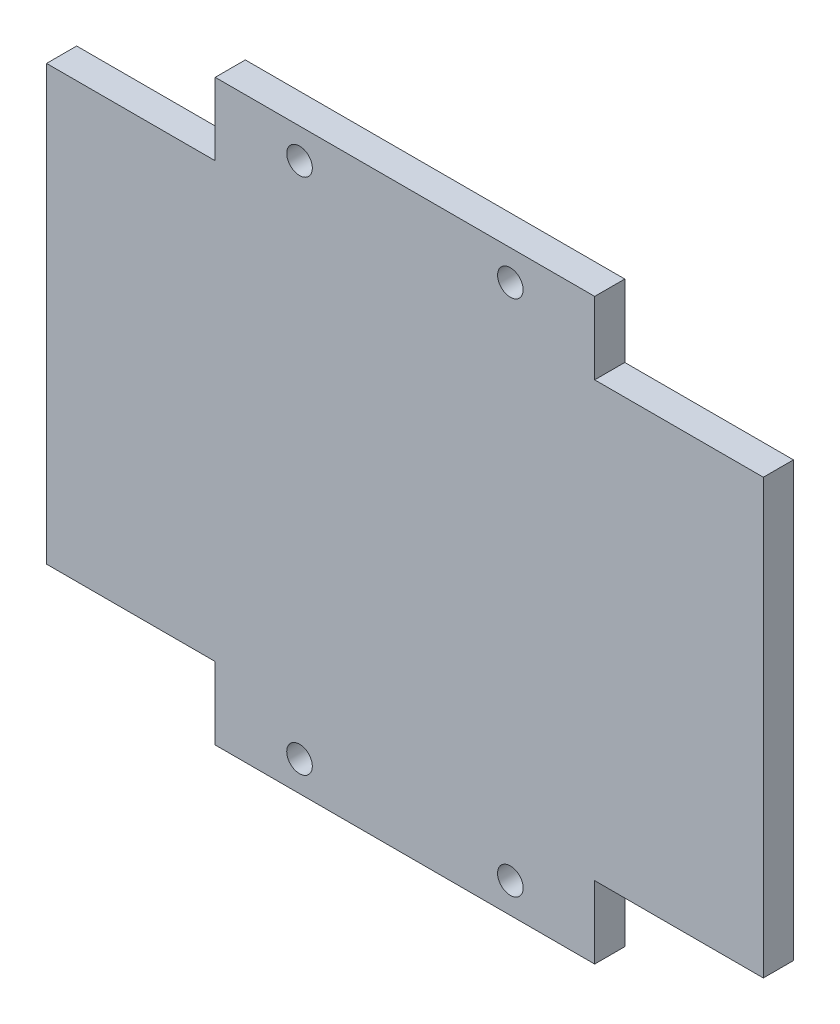
ISO-10303-21;
HEADER;
FILE_DESCRIPTION(('STEP AP214'),'2;1');
FILE_NAME('part.step','',(''),(''),'','','');
FILE_SCHEMA(('AUTOMOTIVE_DESIGN { 1 0 10303 214 1 1 1 1 }'));
ENDSEC;
DATA;
#1=APPLICATION_CONTEXT('core data for automotive mechanical design processes');
#2=APPLICATION_PROTOCOL_DEFINITION('international standard','automotive_design',2000,#1);
#3=PRODUCT_CONTEXT('',#1,'mechanical');
#4=PRODUCT('Part','Part','',(#3));
#5=PRODUCT_RELATED_PRODUCT_CATEGORY('part','',(#4));
#6=PRODUCT_DEFINITION_FORMATION('','',#4);
#7=PRODUCT_DEFINITION_CONTEXT('part definition',#1,'design');
#8=PRODUCT_DEFINITION('design','',#6,#7);
#9=PRODUCT_DEFINITION_SHAPE('','',#8);
#10=(LENGTH_UNIT() NAMED_UNIT(*) SI_UNIT(.MILLI.,.METRE.));
#11=(NAMED_UNIT(*) PLANE_ANGLE_UNIT() SI_UNIT($,.RADIAN.));
#12=(NAMED_UNIT(*) SI_UNIT($,.STERADIAN.) SOLID_ANGLE_UNIT());
#13=UNCERTAINTY_MEASURE_WITH_UNIT(LENGTH_MEASURE(1.E-05),#10,'distance_accuracy_value','');
#14=(GEOMETRIC_REPRESENTATION_CONTEXT(3) GLOBAL_UNCERTAINTY_ASSIGNED_CONTEXT((#13)) GLOBAL_UNIT_ASSIGNED_CONTEXT((#10,
#11,#12)) REPRESENTATION_CONTEXT('',''));
#15=CARTESIAN_POINT('',(0.,0.,0.));
#16=DIRECTION('',(0.,0.,1.));
#17=DIRECTION('',(1.,0.,0.));
#18=AXIS2_PLACEMENT_3D('',#15,#16,#17);
#19=CARTESIAN_POINT('',(0.,0.,5.));
#20=DIRECTION('',(1.,0.,0.));
#21=DIRECTION('',(0.,0.,-1.));
#22=AXIS2_PLACEMENT_3D('',#19,#20,#21);
#23=PLANE('',#22);
#24=DIRECTION('',(0.,0.,1.));
#25=VECTOR('',#24,1.);
#26=CARTESIAN_POINT('',(0.,12.,0.));
#27=LINE('',#26,#25);
#28=CARTESIAN_POINT('',(0.,12.,0.));
#29=VERTEX_POINT('',#28);
#30=CARTESIAN_POINT('',(0.,12.,5.));
#31=VERTEX_POINT('',#30);
#32=EDGE_CURVE('E135',#29,#31,#27,.T.);
#33=ORIENTED_EDGE('',*,*,#32,.F.);
#34=DIRECTION('',(0.,-1.,0.));
#35=VECTOR('',#34,1.);
#36=CARTESIAN_POINT('',(0.,0.,0.));
#37=LINE('',#36,#35);
#38=CARTESIAN_POINT('',(0.,0.,0.));
#39=VERTEX_POINT('',#38);
#40=EDGE_CURVE('E188',#29,#39,#37,.T.);
#41=ORIENTED_EDGE('',*,*,#40,.T.);
#42=DIRECTION('',(0.,0.,-1.));
#43=VECTOR('',#42,1.);
#44=CARTESIAN_POINT('',(0.,0.,5.));
#45=LINE('',#44,#43);
#46=CARTESIAN_POINT('',(0.,0.,5.));
#47=VERTEX_POINT('',#46);
#48=EDGE_CURVE('E11',#47,#39,#45,.T.);
#49=ORIENTED_EDGE('',*,*,#48,.F.);
#50=DIRECTION('',(0.,-1.,0.));
#51=VECTOR('',#50,1.);
#52=CARTESIAN_POINT('',(0.,0.,5.));
#53=LINE('',#52,#51);
#54=EDGE_CURVE('E151',#31,#47,#53,.T.);
#55=ORIENTED_EDGE('',*,*,#54,.F.);
#56=EDGE_LOOP('',(#33,#41,#49,#55));
#57=FACE_BOUND('',#56,.T.);
#58=ADVANCED_FACE('F45',(#57),#23,.F.);
#59=CARTESIAN_POINT('',(63.,0.,5.));
#60=DIRECTION('',(-1.,0.,0.));
#61=DIRECTION('',(0.,0.,1.));
#62=AXIS2_PLACEMENT_3D('',#59,#60,#61);
#63=PLANE('',#62);
#64=DIRECTION('',(0.,0.,1.));
#65=VECTOR('',#64,1.);
#66=CARTESIAN_POINT('',(63.,84.,0.));
#67=LINE('',#66,#65);
#68=CARTESIAN_POINT('',(63.,84.,0.));
#69=VERTEX_POINT('',#68);
#70=CARTESIAN_POINT('',(63.,84.,5.));
#71=VERTEX_POINT('',#70);
#72=EDGE_CURVE('E241',#69,#71,#67,.T.);
#73=ORIENTED_EDGE('',*,*,#72,.F.);
#74=DIRECTION('',(0.,1.,0.));
#75=VECTOR('',#74,1.);
#76=CARTESIAN_POINT('',(63.,0.,0.));
#77=LINE('',#76,#75);
#78=CARTESIAN_POINT('',(63.,96.,0.));
#79=VERTEX_POINT('',#78);
#80=EDGE_CURVE('E191',#69,#79,#77,.T.);
#81=ORIENTED_EDGE('',*,*,#80,.T.);
#82=DIRECTION('',(0.,0.,-1.));
#83=VECTOR('',#82,1.);
#84=CARTESIAN_POINT('',(63.,96.,5.));
#85=LINE('',#84,#83);
#86=CARTESIAN_POINT('',(63.,96.,5.));
#87=VERTEX_POINT('',#86);
#88=EDGE_CURVE('E198',#87,#79,#85,.T.);
#89=ORIENTED_EDGE('',*,*,#88,.F.);
#90=DIRECTION('',(0.,1.,0.));
#91=VECTOR('',#90,1.);
#92=CARTESIAN_POINT('',(63.,0.,5.));
#93=LINE('',#92,#91);
#94=EDGE_CURVE('E174',#71,#87,#93,.T.);
#95=ORIENTED_EDGE('',*,*,#94,.F.);
#96=EDGE_LOOP('',(#73,#81,#89,#95));
#97=FACE_BOUND('',#96,.T.);
#98=ADVANCED_FACE('F304',(#97),#63,.F.);
#99=CARTESIAN_POINT('',(0.,96.,0.));
#100=VERTEX_POINT('',#99);
#101=CARTESIAN_POINT('',(0.,84.,0.));
#102=VERTEX_POINT('',#101);
#103=EDGE_CURVE('E183',#100,#102,#37,.T.);
#104=ORIENTED_EDGE('',*,*,#103,.T.);
#105=DIRECTION('',(0.,0.,1.));
#106=VECTOR('',#105,1.);
#107=CARTESIAN_POINT('',(0.,84.,0.));
#108=LINE('',#107,#106);
#109=CARTESIAN_POINT('',(0.,84.,5.));
#110=VERTEX_POINT('',#109);
#111=EDGE_CURVE('E318',#102,#110,#108,.T.);
#112=ORIENTED_EDGE('',*,*,#111,.T.);
#113=CARTESIAN_POINT('',(0.,96.,5.));
#114=VERTEX_POINT('',#113);
#115=EDGE_CURVE('E160',#114,#110,#53,.T.);
#116=ORIENTED_EDGE('',*,*,#115,.F.);
#117=DIRECTION('',(0.,0.,-1.));
#118=VECTOR('',#117,1.);
#119=CARTESIAN_POINT('',(0.,96.,5.));
#120=LINE('',#119,#118);
#121=EDGE_CURVE('E182',#114,#100,#120,.T.);
#122=ORIENTED_EDGE('',*,*,#121,.T.);
#123=EDGE_LOOP('',(#104,#112,#116,#122));
#124=FACE_BOUND('',#123,.T.);
#125=ADVANCED_FACE('F47',(#124),#23,.F.);
#126=CARTESIAN_POINT('',(0.,0.,5.));
#127=DIRECTION('',(0.,1.,0.));
#128=DIRECTION('',(0.,0.,1.));
#129=AXIS2_PLACEMENT_3D('',#126,#127,#128);
#130=PLANE('',#129);
#131=DIRECTION('',(1.,0.,0.));
#132=VECTOR('',#131,1.);
#133=CARTESIAN_POINT('',(0.,0.,0.));
#134=LINE('',#133,#132);
#135=CARTESIAN_POINT('',(63.,0.,0.));
#136=VERTEX_POINT('',#135);
#137=EDGE_CURVE('E187',#39,#136,#134,.T.);
#138=ORIENTED_EDGE('',*,*,#137,.T.);
#139=DIRECTION('',(0.,0.,-1.));
#140=VECTOR('',#139,1.);
#141=CARTESIAN_POINT('',(63.,0.,5.));
#142=LINE('',#141,#140);
#143=CARTESIAN_POINT('',(63.,0.,5.));
#144=VERTEX_POINT('',#143);
#145=EDGE_CURVE('E54',#144,#136,#142,.T.);
#146=ORIENTED_EDGE('',*,*,#145,.F.);
#147=DIRECTION('',(1.,0.,0.));
#148=VECTOR('',#147,1.);
#149=CARTESIAN_POINT('',(0.,0.,5.));
#150=LINE('',#149,#148);
#151=EDGE_CURVE('E165',#47,#144,#150,.T.);
#152=ORIENTED_EDGE('',*,*,#151,.F.);
#153=ORIENTED_EDGE('',*,*,#48,.T.);
#154=EDGE_LOOP('',(#138,#146,#152,#153));
#155=FACE_BOUND('',#154,.T.);
#156=ADVANCED_FACE('F312',(#155),#130,.F.);
#157=CARTESIAN_POINT('',(63.,12.,0.));
#158=VERTEX_POINT('',#157);
#159=EDGE_CURVE('E166',#136,#158,#77,.T.);
#160=ORIENTED_EDGE('',*,*,#159,.T.);
#161=DIRECTION('',(0.,0.,1.));
#162=VECTOR('',#161,1.);
#163=CARTESIAN_POINT('',(63.,12.,0.));
#164=LINE('',#163,#162);
#165=CARTESIAN_POINT('',(63.,12.,5.));
#166=VERTEX_POINT('',#165);
#167=EDGE_CURVE('E235',#158,#166,#164,.T.);
#168=ORIENTED_EDGE('',*,*,#167,.T.);
#169=EDGE_CURVE('E175',#144,#166,#93,.T.);
#170=ORIENTED_EDGE('',*,*,#169,.F.);
#171=ORIENTED_EDGE('',*,*,#145,.T.);
#172=EDGE_LOOP('',(#160,#168,#170,#171));
#173=FACE_BOUND('',#172,.T.);
#174=ADVANCED_FACE('F207',(#173),#63,.F.);
#175=CARTESIAN_POINT('',(0.,96.,5.));
#176=DIRECTION('',(0.,-1.,0.));
#177=DIRECTION('',(0.,0.,-1.));
#178=AXIS2_PLACEMENT_3D('',#175,#176,#177);
#179=PLANE('',#178);
#180=DIRECTION('',(-1.,0.,0.));
#181=VECTOR('',#180,1.);
#182=CARTESIAN_POINT('',(0.,96.,0.));
#183=LINE('',#182,#181);
#184=EDGE_CURVE('E161',#79,#100,#183,.T.);
#185=ORIENTED_EDGE('',*,*,#184,.T.);
#186=ORIENTED_EDGE('',*,*,#121,.F.);
#187=DIRECTION('',(-1.,0.,0.));
#188=VECTOR('',#187,1.);
#189=CARTESIAN_POINT('',(0.,96.,5.));
#190=LINE('',#189,#188);
#191=EDGE_CURVE('E179',#87,#114,#190,.T.);
#192=ORIENTED_EDGE('',*,*,#191,.F.);
#193=ORIENTED_EDGE('',*,*,#88,.T.);
#194=EDGE_LOOP('',(#185,#186,#192,#193));
#195=FACE_BOUND('',#194,.T.);
#196=ADVANCED_FACE('F288',(#195),#179,.F.);
#197=CARTESIAN_POINT('',(0.,0.,5.));
#198=DIRECTION('',(0.,0.,-1.));
#199=DIRECTION('',(-1.,0.,0.));
#200=AXIS2_PLACEMENT_3D('',#197,#198,#199);
#201=PLANE('',#200);
#202=CARTESIAN_POINT('',(14.,5.,5.));
#203=DIRECTION('',(0.,0.,1.));
#204=DIRECTION('',(-1.,0.,0.));
#205=AXIS2_PLACEMENT_3D('',#202,#203,#204);
#206=CIRCLE('',#205,2.125);
#207=CARTESIAN_POINT('',(11.875,5.,5.));
#208=VERTEX_POINT('',#207);
#209=EDGE_CURVE('E269',#208,#208,#206,.T.);
#210=ORIENTED_EDGE('',*,*,#209,.F.);
#211=EDGE_LOOP('',(#210));
#212=FACE_BOUND('',#211,.T.);
#213=CARTESIAN_POINT('',(49.,5.00000000000002,5.));
#214=DIRECTION('',(0.,0.,1.));
#215=DIRECTION('',(1.,0.,0.));
#216=AXIS2_PLACEMENT_3D('',#213,#214,#215);
#217=CIRCLE('',#216,2.125);
#218=CARTESIAN_POINT('',(51.125,5.00000000000002,5.));
#219=VERTEX_POINT('',#218);
#220=EDGE_CURVE('E261',#219,#219,#217,.T.);
#221=ORIENTED_EDGE('',*,*,#220,.F.);
#222=EDGE_LOOP('',(#221));
#223=FACE_BOUND('',#222,.T.);
#224=CARTESIAN_POINT('',(49.,91.,5.));
#225=DIRECTION('',(0.,0.,1.));
#226=DIRECTION('',(-1.,0.,0.));
#227=AXIS2_PLACEMENT_3D('',#224,#225,#226);
#228=CIRCLE('',#227,2.125);
#229=CARTESIAN_POINT('',(46.875,91.,5.));
#230=VERTEX_POINT('',#229);
#231=EDGE_CURVE('E253',#230,#230,#228,.T.);
#232=ORIENTED_EDGE('',*,*,#231,.F.);
#233=EDGE_LOOP('',(#232));
#234=FACE_BOUND('',#233,.T.);
#235=CARTESIAN_POINT('',(14.,91.,5.));
#236=DIRECTION('',(0.,0.,1.));
#237=DIRECTION('',(1.,0.,0.));
#238=AXIS2_PLACEMENT_3D('',#235,#236,#237);
#239=CIRCLE('',#238,2.125);
#240=CARTESIAN_POINT('',(16.125,91.,5.));
#241=VERTEX_POINT('',#240);
#242=EDGE_CURVE('E170',#241,#241,#239,.T.);
#243=ORIENTED_EDGE('',*,*,#242,.F.);
#244=EDGE_LOOP('',(#243));
#245=FACE_BOUND('',#244,.T.);
#246=ORIENTED_EDGE('',*,*,#115,.T.);
#247=DIRECTION('',(-1.,0.,0.));
#248=VECTOR('',#247,1.);
#249=CARTESIAN_POINT('',(0.,84.,5.));
#250=LINE('',#249,#248);
#251=CARTESIAN_POINT('',(-28.,84.,5.));
#252=VERTEX_POINT('',#251);
#253=EDGE_CURVE('E61',#110,#252,#250,.T.);
#254=ORIENTED_EDGE('',*,*,#253,.T.);
#255=DIRECTION('',(0.,-1.,0.));
#256=VECTOR('',#255,1.);
#257=CARTESIAN_POINT('',(-28.,84.,5.));
#258=LINE('',#257,#256);
#259=CARTESIAN_POINT('',(-28.,12.,5.));
#260=VERTEX_POINT('',#259);
#261=EDGE_CURVE('E154',#252,#260,#258,.T.);
#262=ORIENTED_EDGE('',*,*,#261,.T.);
#263=DIRECTION('',(1.,0.,0.));
#264=VECTOR('',#263,1.);
#265=CARTESIAN_POINT('',(0.,12.,5.));
#266=LINE('',#265,#264);
#267=EDGE_CURVE('E138',#260,#31,#266,.T.);
#268=ORIENTED_EDGE('',*,*,#267,.T.);
#269=ORIENTED_EDGE('',*,*,#54,.T.);
#270=ORIENTED_EDGE('',*,*,#151,.T.);
#271=ORIENTED_EDGE('',*,*,#169,.T.);
#272=DIRECTION('',(1.,0.,0.));
#273=VECTOR('',#272,1.);
#274=CARTESIAN_POINT('',(63.,12.,5.));
#275=LINE('',#274,#273);
#276=CARTESIAN_POINT('',(91.,12.,5.));
#277=VERTEX_POINT('',#276);
#278=EDGE_CURVE('E69',#166,#277,#275,.T.);
#279=ORIENTED_EDGE('',*,*,#278,.T.);
#280=DIRECTION('',(0.,1.,0.));
#281=VECTOR('',#280,1.);
#282=CARTESIAN_POINT('',(91.,84.,5.));
#283=LINE('',#282,#281);
#284=CARTESIAN_POINT('',(91.,84.,5.));
#285=VERTEX_POINT('',#284);
#286=EDGE_CURVE('E228',#277,#285,#283,.T.);
#287=ORIENTED_EDGE('',*,*,#286,.T.);
#288=DIRECTION('',(-1.,0.,0.));
#289=VECTOR('',#288,1.);
#290=CARTESIAN_POINT('',(63.,84.,5.));
#291=LINE('',#290,#289);
#292=EDGE_CURVE('E221',#285,#71,#291,.T.);
#293=ORIENTED_EDGE('',*,*,#292,.T.);
#294=ORIENTED_EDGE('',*,*,#94,.T.);
#295=ORIENTED_EDGE('',*,*,#191,.T.);
#296=EDGE_LOOP('',(#246,#254,#262,#268,#269,#270,#271,#279,#287,#293,#294,#295));
#297=FACE_BOUND('',#296,.T.);
#298=ADVANCED_FACE('F150',(#212,#223,#234,#245,#297),#201,.F.);
#299=CARTESIAN_POINT('',(0.,0.,0.));
#300=DIRECTION('',(0.,0.,-1.));
#301=DIRECTION('',(-1.,0.,0.));
#302=AXIS2_PLACEMENT_3D('',#299,#300,#301);
#303=PLANE('',#302);
#304=CARTESIAN_POINT('',(14.,5.,0.));
#305=DIRECTION('',(0.,0.,1.));
#306=DIRECTION('',(-1.,0.,0.));
#307=AXIS2_PLACEMENT_3D('',#304,#305,#306);
#308=CIRCLE('',#307,2.125);
#309=CARTESIAN_POINT('',(11.875,5.,0.));
#310=VERTEX_POINT('',#309);
#311=EDGE_CURVE('E244',#310,#310,#308,.T.);
#312=ORIENTED_EDGE('',*,*,#311,.T.);
#313=EDGE_LOOP('',(#312));
#314=FACE_BOUND('',#313,.T.);
#315=CARTESIAN_POINT('',(49.,5.00000000000002,0.));
#316=DIRECTION('',(0.,0.,1.));
#317=DIRECTION('',(1.,0.,0.));
#318=AXIS2_PLACEMENT_3D('',#315,#316,#317);
#319=CIRCLE('',#318,2.125);
#320=CARTESIAN_POINT('',(51.125,5.00000000000002,0.));
#321=VERTEX_POINT('',#320);
#322=EDGE_CURVE('E265',#321,#321,#319,.T.);
#323=ORIENTED_EDGE('',*,*,#322,.T.);
#324=EDGE_LOOP('',(#323));
#325=FACE_BOUND('',#324,.T.);
#326=CARTESIAN_POINT('',(49.,91.,0.));
#327=DIRECTION('',(0.,0.,1.));
#328=DIRECTION('',(-1.,0.,0.));
#329=AXIS2_PLACEMENT_3D('',#326,#327,#328);
#330=CIRCLE('',#329,2.125);
#331=CARTESIAN_POINT('',(46.875,91.,0.));
#332=VERTEX_POINT('',#331);
#333=EDGE_CURVE('E257',#332,#332,#330,.T.);
#334=ORIENTED_EDGE('',*,*,#333,.T.);
#335=EDGE_LOOP('',(#334));
#336=FACE_BOUND('',#335,.T.);
#337=CARTESIAN_POINT('',(14.,91.,0.));
#338=DIRECTION('',(0.,0.,1.));
#339=DIRECTION('',(1.,0.,0.));
#340=AXIS2_PLACEMENT_3D('',#337,#338,#339);
#341=CIRCLE('',#340,2.125);
#342=CARTESIAN_POINT('',(16.125,91.,0.));
#343=VERTEX_POINT('',#342);
#344=EDGE_CURVE('E275',#343,#343,#341,.T.);
#345=ORIENTED_EDGE('',*,*,#344,.T.);
#346=EDGE_LOOP('',(#345));
#347=FACE_BOUND('',#346,.T.);
#348=ORIENTED_EDGE('',*,*,#103,.F.);
#349=ORIENTED_EDGE('',*,*,#184,.F.);
#350=ORIENTED_EDGE('',*,*,#80,.F.);
#351=DIRECTION('',(-1.,0.,0.));
#352=VECTOR('',#351,1.);
#353=CARTESIAN_POINT('',(63.,84.,0.));
#354=LINE('',#353,#352);
#355=CARTESIAN_POINT('',(91.,84.,0.));
#356=VERTEX_POINT('',#355);
#357=EDGE_CURVE('E225',#356,#69,#354,.T.);
#358=ORIENTED_EDGE('',*,*,#357,.F.);
#359=DIRECTION('',(0.,1.,0.));
#360=VECTOR('',#359,1.);
#361=CARTESIAN_POINT('',(91.,84.,0.));
#362=LINE('',#361,#360);
#363=CARTESIAN_POINT('',(91.,12.,0.));
#364=VERTEX_POINT('',#363);
#365=EDGE_CURVE('E219',#364,#356,#362,.T.);
#366=ORIENTED_EDGE('',*,*,#365,.F.);
#367=DIRECTION('',(1.,0.,0.));
#368=VECTOR('',#367,1.);
#369=CARTESIAN_POINT('',(63.,12.,0.));
#370=LINE('',#369,#368);
#371=EDGE_CURVE('E216',#158,#364,#370,.T.);
#372=ORIENTED_EDGE('',*,*,#371,.F.);
#373=ORIENTED_EDGE('',*,*,#159,.F.);
#374=ORIENTED_EDGE('',*,*,#137,.F.);
#375=ORIENTED_EDGE('',*,*,#40,.F.);
#376=DIRECTION('',(1.,0.,0.));
#377=VECTOR('',#376,1.);
#378=CARTESIAN_POINT('',(0.,12.,0.));
#379=LINE('',#378,#377);
#380=CARTESIAN_POINT('',(-28.,12.,0.));
#381=VERTEX_POINT('',#380);
#382=EDGE_CURVE('E140',#381,#29,#379,.T.);
#383=ORIENTED_EDGE('',*,*,#382,.F.);
#384=DIRECTION('',(0.,-1.,0.));
#385=VECTOR('',#384,1.);
#386=CARTESIAN_POINT('',(-28.,84.,0.));
#387=LINE('',#386,#385);
#388=CARTESIAN_POINT('',(-28.,84.,0.));
#389=VERTEX_POINT('',#388);
#390=EDGE_CURVE('E326',#389,#381,#387,.T.);
#391=ORIENTED_EDGE('',*,*,#390,.F.);
#392=DIRECTION('',(-1.,0.,0.));
#393=VECTOR('',#392,1.);
#394=CARTESIAN_POINT('',(0.,84.,0.));
#395=LINE('',#394,#393);
#396=EDGE_CURVE('E156',#102,#389,#395,.T.);
#397=ORIENTED_EDGE('',*,*,#396,.F.);
#398=EDGE_LOOP('',(#348,#349,#350,#358,#366,#372,#373,#374,#375,#383,#391,#397));
#399=FACE_BOUND('',#398,.T.);
#400=ADVANCED_FACE('F213',(#314,#325,#336,#347,#399),#303,.T.);
#401=CARTESIAN_POINT('',(14.,91.,0.));
#402=DIRECTION('',(0.,0.,1.));
#403=DIRECTION('',(1.,0.,0.));
#404=AXIS2_PLACEMENT_3D('',#401,#402,#403);
#405=CYLINDRICAL_SURFACE('',#404,2.125);
#406=ORIENTED_EDGE('',*,*,#344,.F.);
#407=EDGE_LOOP('',(#406));
#408=FACE_BOUND('',#407,.T.);
#409=ORIENTED_EDGE('',*,*,#242,.T.);
#410=EDGE_LOOP('',(#409));
#411=FACE_BOUND('',#410,.T.);
#412=ADVANCED_FACE('F285',(#408,#411),#405,.F.);
#413=CARTESIAN_POINT('',(49.,91.,0.));
#414=DIRECTION('',(0.,0.,1.));
#415=DIRECTION('',(1.,0.,0.));
#416=AXIS2_PLACEMENT_3D('',#413,#414,#415);
#417=CYLINDRICAL_SURFACE('',#416,2.125);
#418=ORIENTED_EDGE('',*,*,#333,.F.);
#419=EDGE_LOOP('',(#418));
#420=FACE_BOUND('',#419,.T.);
#421=ORIENTED_EDGE('',*,*,#231,.T.);
#422=EDGE_LOOP('',(#421));
#423=FACE_BOUND('',#422,.T.);
#424=ADVANCED_FACE('F367',(#420,#423),#417,.F.);
#425=CARTESIAN_POINT('',(49.,5.00000000000002,0.));
#426=DIRECTION('',(0.,0.,1.));
#427=DIRECTION('',(1.,0.,0.));
#428=AXIS2_PLACEMENT_3D('',#425,#426,#427);
#429=CYLINDRICAL_SURFACE('',#428,2.125);
#430=ORIENTED_EDGE('',*,*,#322,.F.);
#431=EDGE_LOOP('',(#430));
#432=FACE_BOUND('',#431,.T.);
#433=ORIENTED_EDGE('',*,*,#220,.T.);
#434=EDGE_LOOP('',(#433));
#435=FACE_BOUND('',#434,.T.);
#436=ADVANCED_FACE('F370',(#432,#435),#429,.F.);
#437=CARTESIAN_POINT('',(14.,5.,0.));
#438=DIRECTION('',(0.,0.,1.));
#439=DIRECTION('',(1.,0.,0.));
#440=AXIS2_PLACEMENT_3D('',#437,#438,#439);
#441=CYLINDRICAL_SURFACE('',#440,2.125);
#442=ORIENTED_EDGE('',*,*,#311,.F.);
#443=EDGE_LOOP('',(#442));
#444=FACE_BOUND('',#443,.T.);
#445=ORIENTED_EDGE('',*,*,#209,.T.);
#446=EDGE_LOOP('',(#445));
#447=FACE_BOUND('',#446,.T.);
#448=ADVANCED_FACE('F374',(#444,#447),#441,.F.);
#449=CARTESIAN_POINT('',(63.,84.,0.));
#450=DIRECTION('',(0.,1.,0.));
#451=DIRECTION('',(0.,0.,1.));
#452=AXIS2_PLACEMENT_3D('',#449,#450,#451);
#453=PLANE('',#452);
#454=ORIENTED_EDGE('',*,*,#292,.F.);
#455=DIRECTION('',(0.,0.,1.));
#456=VECTOR('',#455,1.);
#457=CARTESIAN_POINT('',(91.,84.,0.));
#458=LINE('',#457,#456);
#459=EDGE_CURVE('E245',#356,#285,#458,.T.);
#460=ORIENTED_EDGE('',*,*,#459,.F.);
#461=ORIENTED_EDGE('',*,*,#357,.T.);
#462=ORIENTED_EDGE('',*,*,#72,.T.);
#463=EDGE_LOOP('',(#454,#460,#461,#462));
#464=FACE_BOUND('',#463,.T.);
#465=ADVANCED_FACE('F352',(#464),#453,.T.);
#466=CARTESIAN_POINT('',(91.,84.,0.));
#467=DIRECTION('',(1.,0.,0.));
#468=DIRECTION('',(0.,1.,0.));
#469=AXIS2_PLACEMENT_3D('',#466,#467,#468);
#470=PLANE('',#469);
#471=ORIENTED_EDGE('',*,*,#286,.F.);
#472=DIRECTION('',(0.,0.,1.));
#473=VECTOR('',#472,1.);
#474=CARTESIAN_POINT('',(91.,12.,0.));
#475=LINE('',#474,#473);
#476=EDGE_CURVE('E248',#364,#277,#475,.T.);
#477=ORIENTED_EDGE('',*,*,#476,.F.);
#478=ORIENTED_EDGE('',*,*,#365,.T.);
#479=ORIENTED_EDGE('',*,*,#459,.T.);
#480=EDGE_LOOP('',(#471,#477,#478,#479));
#481=FACE_BOUND('',#480,.T.);
#482=ADVANCED_FACE('F355',(#481),#470,.T.);
#483=CARTESIAN_POINT('',(63.,12.,0.));
#484=DIRECTION('',(0.,-1.,0.));
#485=DIRECTION('',(1.,0.,0.));
#486=AXIS2_PLACEMENT_3D('',#483,#484,#485);
#487=PLANE('',#486);
#488=ORIENTED_EDGE('',*,*,#278,.F.);
#489=ORIENTED_EDGE('',*,*,#167,.F.);
#490=ORIENTED_EDGE('',*,*,#371,.T.);
#491=ORIENTED_EDGE('',*,*,#476,.T.);
#492=EDGE_LOOP('',(#488,#489,#490,#491));
#493=FACE_BOUND('',#492,.T.);
#494=ADVANCED_FACE('F356',(#493),#487,.T.);
#495=CARTESIAN_POINT('',(0.,12.,0.));
#496=DIRECTION('',(0.,-1.,0.));
#497=DIRECTION('',(0.,0.,-1.));
#498=AXIS2_PLACEMENT_3D('',#495,#496,#497);
#499=PLANE('',#498);
#500=ORIENTED_EDGE('',*,*,#267,.F.);
#501=DIRECTION('',(0.,0.,1.));
#502=VECTOR('',#501,1.);
#503=CARTESIAN_POINT('',(-28.,12.,0.));
#504=LINE('',#503,#502);
#505=EDGE_CURVE('E145',#381,#260,#504,.T.);
#506=ORIENTED_EDGE('',*,*,#505,.F.);
#507=ORIENTED_EDGE('',*,*,#382,.T.);
#508=ORIENTED_EDGE('',*,*,#32,.T.);
#509=EDGE_LOOP('',(#500,#506,#507,#508));
#510=FACE_BOUND('',#509,.T.);
#511=ADVANCED_FACE('F137',(#510),#499,.T.);
#512=CARTESIAN_POINT('',(-28.,84.,0.));
#513=DIRECTION('',(-1.,0.,0.));
#514=DIRECTION('',(0.,-1.,0.));
#515=AXIS2_PLACEMENT_3D('',#512,#513,#514);
#516=PLANE('',#515);
#517=ORIENTED_EDGE('',*,*,#261,.F.);
#518=DIRECTION('',(0.,0.,1.));
#519=VECTOR('',#518,1.);
#520=CARTESIAN_POINT('',(-28.,84.,0.));
#521=LINE('',#520,#519);
#522=EDGE_CURVE('E339',#389,#252,#521,.T.);
#523=ORIENTED_EDGE('',*,*,#522,.F.);
#524=ORIENTED_EDGE('',*,*,#390,.T.);
#525=ORIENTED_EDGE('',*,*,#505,.T.);
#526=EDGE_LOOP('',(#517,#523,#524,#525));
#527=FACE_BOUND('',#526,.T.);
#528=ADVANCED_FACE('F344',(#527),#516,.T.);
#529=CARTESIAN_POINT('',(0.,84.,0.));
#530=DIRECTION('',(0.,1.,0.));
#531=DIRECTION('',(0.,0.,1.));
#532=AXIS2_PLACEMENT_3D('',#529,#530,#531);
#533=PLANE('',#532);
#534=ORIENTED_EDGE('',*,*,#253,.F.);
#535=ORIENTED_EDGE('',*,*,#111,.F.);
#536=ORIENTED_EDGE('',*,*,#396,.T.);
#537=ORIENTED_EDGE('',*,*,#522,.T.);
#538=EDGE_LOOP('',(#534,#535,#536,#537));
#539=FACE_BOUND('',#538,.T.);
#540=ADVANCED_FACE('F343',(#539),#533,.T.);
#541=CLOSED_SHELL('',(#58,#98,#125,#156,#174,#196,#298,#400,#412,#424,#436,#448,#465,#482,#494,
#511,#528,#540));
#542=MANIFOLD_SOLID_BREP('B2',#541);
#543=ADVANCED_BREP_SHAPE_REPRESENTATION('',(#18,#542),#14);
#544=SHAPE_DEFINITION_REPRESENTATION(#9,#543);
ENDSEC;
END-ISO-10303-21;
